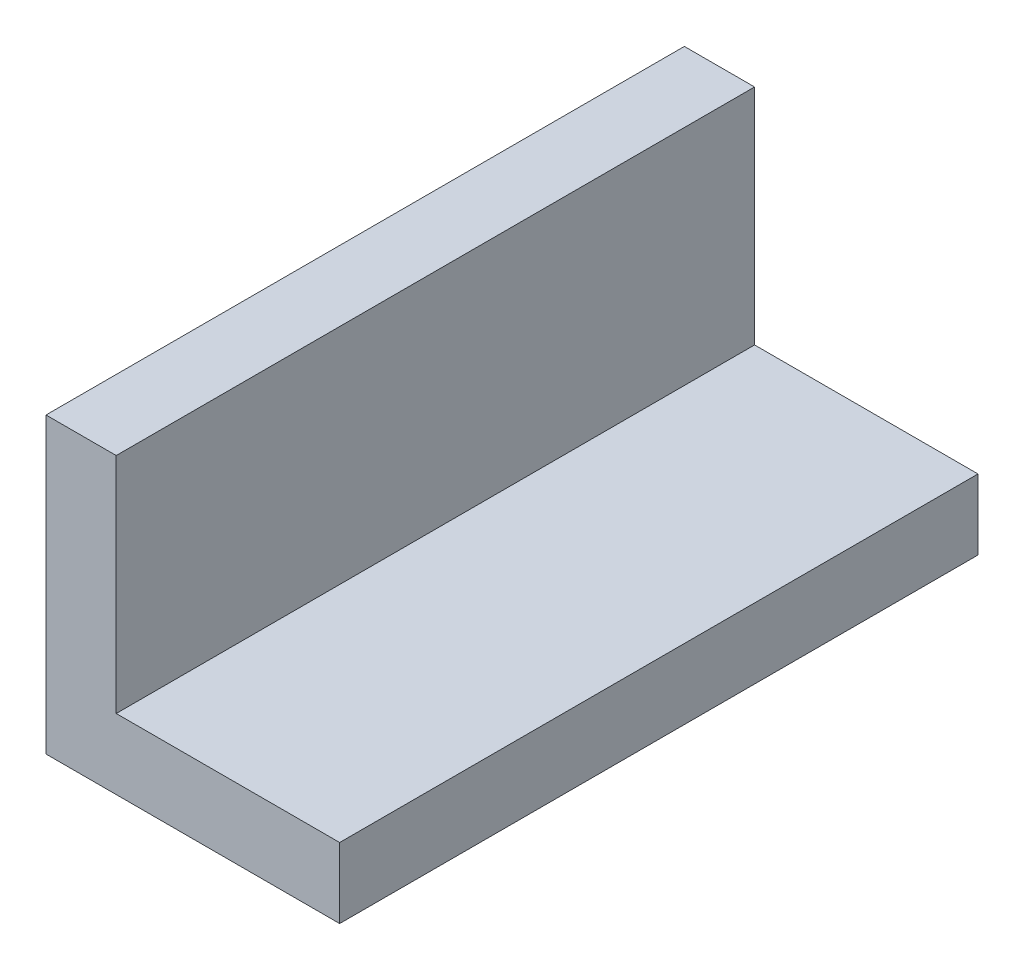
ISO-10303-21;
HEADER;
FILE_DESCRIPTION(('STEP AP214'),'2;1');
FILE_NAME('part.step','',(''),(''),'','','');
FILE_SCHEMA(('AUTOMOTIVE_DESIGN { 1 0 10303 214 1 1 1 1 }'));
ENDSEC;
DATA;
#1=APPLICATION_CONTEXT('core data for automotive mechanical design processes');
#2=APPLICATION_PROTOCOL_DEFINITION('international standard','automotive_design',2000,#1);
#3=PRODUCT_CONTEXT('',#1,'mechanical');
#4=PRODUCT('Part','Part','',(#3));
#5=PRODUCT_RELATED_PRODUCT_CATEGORY('part','',(#4));
#6=PRODUCT_DEFINITION_FORMATION('','',#4);
#7=PRODUCT_DEFINITION_CONTEXT('part definition',#1,'design');
#8=PRODUCT_DEFINITION('design','',#6,#7);
#9=PRODUCT_DEFINITION_SHAPE('','',#8);
#10=(LENGTH_UNIT() NAMED_UNIT(*) SI_UNIT(.MILLI.,.METRE.));
#11=(NAMED_UNIT(*) PLANE_ANGLE_UNIT() SI_UNIT($,.RADIAN.));
#12=(NAMED_UNIT(*) SI_UNIT($,.STERADIAN.) SOLID_ANGLE_UNIT());
#13=UNCERTAINTY_MEASURE_WITH_UNIT(LENGTH_MEASURE(1.E-05),#10,'distance_accuracy_value','');
#14=(GEOMETRIC_REPRESENTATION_CONTEXT(3) GLOBAL_UNCERTAINTY_ASSIGNED_CONTEXT((#13)) GLOBAL_UNIT_ASSIGNED_CONTEXT((#10,
#11,#12)) REPRESENTATION_CONTEXT('',''));
#15=CARTESIAN_POINT('',(0.,0.,0.));
#16=DIRECTION('',(0.,0.,1.));
#17=DIRECTION('',(1.,0.,0.));
#18=AXIS2_PLACEMENT_3D('',#15,#16,#17);
#19=CARTESIAN_POINT('',(81.,0.,100.));
#20=DIRECTION('',(0.,-1.,0.));
#21=DIRECTION('',(1.,0.,0.));
#22=AXIS2_PLACEMENT_3D('',#19,#20,#21);
#23=PLANE('',#22);
#24=DIRECTION('',(-1.,0.,0.));
#25=VECTOR('',#24,1.);
#26=CARTESIAN_POINT('',(81.,0.,-100.));
#27=LINE('',#26,#25);
#28=CARTESIAN_POINT('',(81.,0.,-100.));
#29=VERTEX_POINT('',#28);
#30=CARTESIAN_POINT('',(11.,0.,-100.));
#31=VERTEX_POINT('',#30);
#32=EDGE_CURVE('E121',#29,#31,#27,.T.);
#33=ORIENTED_EDGE('',*,*,#32,.T.);
#34=DIRECTION('',(0.,0.,-1.));
#35=VECTOR('',#34,1.);
#36=CARTESIAN_POINT('',(11.,0.,100.));
#37=LINE('',#36,#35);
#38=CARTESIAN_POINT('',(11.,0.,100.));
#39=VERTEX_POINT('',#38);
#40=EDGE_CURVE('E11',#39,#31,#37,.T.);
#41=ORIENTED_EDGE('',*,*,#40,.F.);
#42=DIRECTION('',(-1.,0.,0.));
#43=VECTOR('',#42,1.);
#44=CARTESIAN_POINT('',(81.,0.,100.));
#45=LINE('',#44,#43);
#46=CARTESIAN_POINT('',(81.,0.,100.));
#47=VERTEX_POINT('',#46);
#48=EDGE_CURVE('E131',#47,#39,#45,.T.);
#49=ORIENTED_EDGE('',*,*,#48,.F.);
#50=DIRECTION('',(0.,0.,-1.));
#51=VECTOR('',#50,1.);
#52=CARTESIAN_POINT('',(81.,0.,100.));
#53=LINE('',#52,#51);
#54=EDGE_CURVE('E117',#47,#29,#53,.T.);
#55=ORIENTED_EDGE('',*,*,#54,.T.);
#56=EDGE_LOOP('',(#33,#41,#49,#55));
#57=FACE_BOUND('',#56,.T.);
#58=ADVANCED_FACE('F37',(#57),#23,.F.);
#59=CARTESIAN_POINT('',(11.,0.,100.));
#60=DIRECTION('',(-1.,0.,0.));
#61=DIRECTION('',(0.,-1.,0.));
#62=AXIS2_PLACEMENT_3D('',#59,#60,#61);
#63=PLANE('',#62);
#64=DIRECTION('',(0.,1.,0.));
#65=VECTOR('',#64,1.);
#66=CARTESIAN_POINT('',(11.,0.,-100.));
#67=LINE('',#66,#65);
#68=CARTESIAN_POINT('',(11.,70.,-100.));
#69=VERTEX_POINT('',#68);
#70=EDGE_CURVE('E124',#31,#69,#67,.T.);
#71=ORIENTED_EDGE('',*,*,#70,.T.);
#72=DIRECTION('',(0.,0.,-1.));
#73=VECTOR('',#72,1.);
#74=CARTESIAN_POINT('',(11.,70.,100.));
#75=LINE('',#74,#73);
#76=CARTESIAN_POINT('',(11.,70.,100.));
#77=VERTEX_POINT('',#76);
#78=EDGE_CURVE('E45',#77,#69,#75,.T.);
#79=ORIENTED_EDGE('',*,*,#78,.F.);
#80=DIRECTION('',(0.,1.,0.));
#81=VECTOR('',#80,1.);
#82=CARTESIAN_POINT('',(11.,0.,100.));
#83=LINE('',#82,#81);
#84=EDGE_CURVE('E90',#39,#77,#83,.T.);
#85=ORIENTED_EDGE('',*,*,#84,.F.);
#86=ORIENTED_EDGE('',*,*,#40,.T.);
#87=EDGE_LOOP('',(#71,#79,#85,#86));
#88=FACE_BOUND('',#87,.T.);
#89=ADVANCED_FACE('F155',(#88),#63,.F.);
#90=CARTESIAN_POINT('',(11.,70.,100.));
#91=DIRECTION('',(0.,-1.,0.));
#92=DIRECTION('',(0.,0.,-1.));
#93=AXIS2_PLACEMENT_3D('',#90,#91,#92);
#94=PLANE('',#93);
#95=DIRECTION('',(-1.,0.,0.));
#96=VECTOR('',#95,1.);
#97=CARTESIAN_POINT('',(11.,70.,-100.));
#98=LINE('',#97,#96);
#99=CARTESIAN_POINT('',(-11.,70.,-100.));
#100=VERTEX_POINT('',#99);
#101=EDGE_CURVE('E126',#69,#100,#98,.T.);
#102=ORIENTED_EDGE('',*,*,#101,.T.);
#103=DIRECTION('',(0.,0.,-1.));
#104=VECTOR('',#103,1.);
#105=CARTESIAN_POINT('',(-11.,70.,100.));
#106=LINE('',#105,#104);
#107=CARTESIAN_POINT('',(-11.,70.,100.));
#108=VERTEX_POINT('',#107);
#109=EDGE_CURVE('E112',#108,#100,#106,.T.);
#110=ORIENTED_EDGE('',*,*,#109,.F.);
#111=DIRECTION('',(-1.,0.,0.));
#112=VECTOR('',#111,1.);
#113=CARTESIAN_POINT('',(11.,70.,100.));
#114=LINE('',#113,#112);
#115=EDGE_CURVE('E103',#77,#108,#114,.T.);
#116=ORIENTED_EDGE('',*,*,#115,.F.);
#117=ORIENTED_EDGE('',*,*,#78,.T.);
#118=EDGE_LOOP('',(#102,#110,#116,#117));
#119=FACE_BOUND('',#118,.T.);
#120=ADVANCED_FACE('F137',(#119),#94,.F.);
#121=CARTESIAN_POINT('',(-11.,70.,100.));
#122=DIRECTION('',(1.,0.,0.));
#123=DIRECTION('',(0.,1.,0.));
#124=AXIS2_PLACEMENT_3D('',#121,#122,#123);
#125=PLANE('',#124);
#126=DIRECTION('',(0.,-1.,0.));
#127=VECTOR('',#126,1.);
#128=CARTESIAN_POINT('',(-11.,70.,-100.));
#129=LINE('',#128,#127);
#130=CARTESIAN_POINT('',(-11.,-22.,-100.));
#131=VERTEX_POINT('',#130);
#132=EDGE_CURVE('E111',#100,#131,#129,.T.);
#133=ORIENTED_EDGE('',*,*,#132,.T.);
#134=DIRECTION('',(0.,0.,-1.));
#135=VECTOR('',#134,1.);
#136=CARTESIAN_POINT('',(-11.,-22.,100.));
#137=LINE('',#136,#135);
#138=CARTESIAN_POINT('',(-11.,-22.,100.));
#139=VERTEX_POINT('',#138);
#140=EDGE_CURVE('E108',#139,#131,#137,.T.);
#141=ORIENTED_EDGE('',*,*,#140,.F.);
#142=DIRECTION('',(0.,-1.,0.));
#143=VECTOR('',#142,1.);
#144=CARTESIAN_POINT('',(-11.,70.,100.));
#145=LINE('',#144,#143);
#146=EDGE_CURVE('E97',#108,#139,#145,.T.);
#147=ORIENTED_EDGE('',*,*,#146,.F.);
#148=ORIENTED_EDGE('',*,*,#109,.T.);
#149=EDGE_LOOP('',(#133,#141,#147,#148));
#150=FACE_BOUND('',#149,.T.);
#151=ADVANCED_FACE('F109',(#150),#125,.F.);
#152=CARTESIAN_POINT('',(-11.,-22.,100.));
#153=DIRECTION('',(0.,1.,0.));
#154=DIRECTION('',(0.,0.,1.));
#155=AXIS2_PLACEMENT_3D('',#152,#153,#154);
#156=PLANE('',#155);
#157=DIRECTION('',(1.,0.,0.));
#158=VECTOR('',#157,1.);
#159=CARTESIAN_POINT('',(-11.,-22.,-100.));
#160=LINE('',#159,#158);
#161=CARTESIAN_POINT('',(81.,-22.,-100.));
#162=VERTEX_POINT('',#161);
#163=EDGE_CURVE('E76',#131,#162,#160,.T.);
#164=ORIENTED_EDGE('',*,*,#163,.T.);
#165=DIRECTION('',(0.,0.,-1.));
#166=VECTOR('',#165,1.);
#167=CARTESIAN_POINT('',(81.,-22.,100.));
#168=LINE('',#167,#166);
#169=CARTESIAN_POINT('',(81.,-22.,100.));
#170=VERTEX_POINT('',#169);
#171=EDGE_CURVE('E113',#170,#162,#168,.T.);
#172=ORIENTED_EDGE('',*,*,#171,.F.);
#173=DIRECTION('',(1.,0.,0.));
#174=VECTOR('',#173,1.);
#175=CARTESIAN_POINT('',(-11.,-22.,100.));
#176=LINE('',#175,#174);
#177=EDGE_CURVE('E101',#139,#170,#176,.T.);
#178=ORIENTED_EDGE('',*,*,#177,.F.);
#179=ORIENTED_EDGE('',*,*,#140,.T.);
#180=EDGE_LOOP('',(#164,#172,#178,#179));
#181=FACE_BOUND('',#180,.T.);
#182=ADVANCED_FACE('F115',(#181),#156,.F.);
#183=CARTESIAN_POINT('',(81.,-22.,100.));
#184=DIRECTION('',(-1.,0.,0.));
#185=DIRECTION('',(0.,0.,1.));
#186=AXIS2_PLACEMENT_3D('',#183,#184,#185);
#187=PLANE('',#186);
#188=DIRECTION('',(0.,1.,0.));
#189=VECTOR('',#188,1.);
#190=CARTESIAN_POINT('',(81.,-22.,-100.));
#191=LINE('',#190,#189);
#192=EDGE_CURVE('E82',#162,#29,#191,.T.);
#193=ORIENTED_EDGE('',*,*,#192,.T.);
#194=ORIENTED_EDGE('',*,*,#54,.F.);
#195=DIRECTION('',(0.,1.,0.));
#196=VECTOR('',#195,1.);
#197=CARTESIAN_POINT('',(81.,-22.,100.));
#198=LINE('',#197,#196);
#199=EDGE_CURVE('E53',#170,#47,#198,.T.);
#200=ORIENTED_EDGE('',*,*,#199,.F.);
#201=ORIENTED_EDGE('',*,*,#171,.T.);
#202=EDGE_LOOP('',(#193,#194,#200,#201));
#203=FACE_BOUND('',#202,.T.);
#204=ADVANCED_FACE('F144',(#203),#187,.F.);
#205=CARTESIAN_POINT('',(0.,0.,100.));
#206=DIRECTION('',(0.,0.,-1.));
#207=DIRECTION('',(-1.,0.,0.));
#208=AXIS2_PLACEMENT_3D('',#205,#206,#207);
#209=PLANE('',#208);
#210=ORIENTED_EDGE('',*,*,#48,.T.);
#211=ORIENTED_EDGE('',*,*,#84,.T.);
#212=ORIENTED_EDGE('',*,*,#115,.T.);
#213=ORIENTED_EDGE('',*,*,#146,.T.);
#214=ORIENTED_EDGE('',*,*,#177,.T.);
#215=ORIENTED_EDGE('',*,*,#199,.T.);
#216=EDGE_LOOP('',(#210,#211,#212,#213,#214,#215));
#217=FACE_BOUND('',#216,.T.);
#218=ADVANCED_FACE('F99',(#217),#209,.F.);
#219=CARTESIAN_POINT('',(0.,0.,-100.));
#220=DIRECTION('',(0.,0.,-1.));
#221=DIRECTION('',(-1.,0.,0.));
#222=AXIS2_PLACEMENT_3D('',#219,#220,#221);
#223=PLANE('',#222);
#224=ORIENTED_EDGE('',*,*,#32,.F.);
#225=ORIENTED_EDGE('',*,*,#192,.F.);
#226=ORIENTED_EDGE('',*,*,#163,.F.);
#227=ORIENTED_EDGE('',*,*,#132,.F.);
#228=ORIENTED_EDGE('',*,*,#101,.F.);
#229=ORIENTED_EDGE('',*,*,#70,.F.);
#230=EDGE_LOOP('',(#224,#225,#226,#227,#228,#229));
#231=FACE_BOUND('',#230,.T.);
#232=ADVANCED_FACE('F140',(#231),#223,.T.);
#233=CLOSED_SHELL('',(#58,#89,#120,#151,#182,#204,#218,#232));
#234=MANIFOLD_SOLID_BREP('B2',#233);
#235=ADVANCED_BREP_SHAPE_REPRESENTATION('',(#18,#234),#14);
#236=SHAPE_DEFINITION_REPRESENTATION(#9,#235);
ENDSEC;
END-ISO-10303-21;
